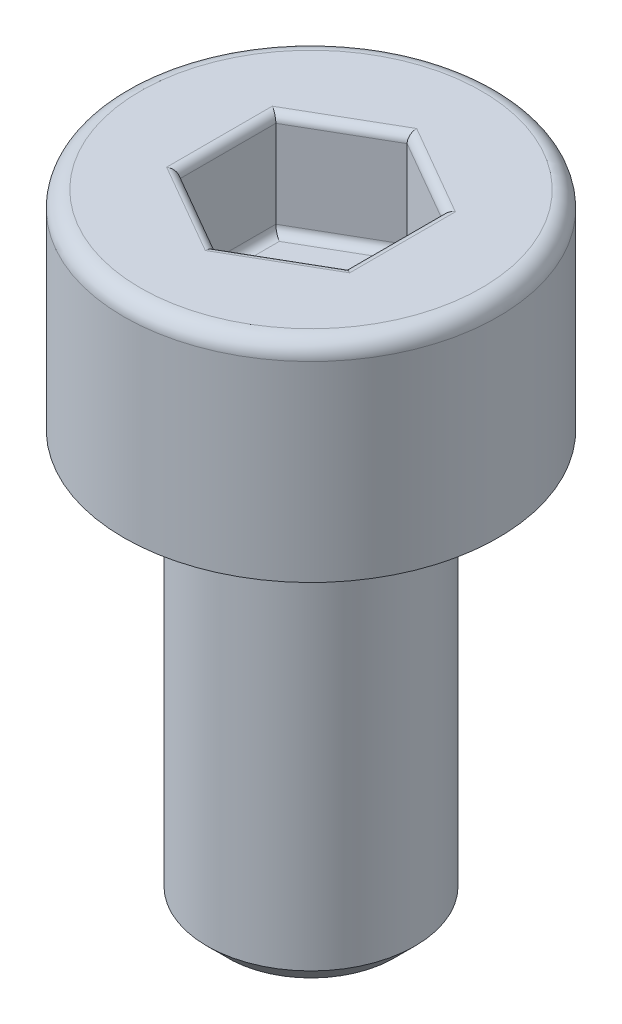
ISO-10303-21;
HEADER;
FILE_DESCRIPTION(('STEP AP214'),'2;1');
FILE_NAME('part.step','',(''),(''),'','','');
FILE_SCHEMA(('AUTOMOTIVE_DESIGN { 1 0 10303 214 1 1 1 1 }'));
ENDSEC;
DATA;
#1=APPLICATION_CONTEXT('core data for automotive mechanical design processes');
#2=APPLICATION_PROTOCOL_DEFINITION('international standard','automotive_design',2000,#1);
#3=PRODUCT_CONTEXT('',#1,'mechanical');
#4=PRODUCT('Part','Part','',(#3));
#5=PRODUCT_RELATED_PRODUCT_CATEGORY('part','',(#4));
#6=PRODUCT_DEFINITION_FORMATION('','',#4);
#7=PRODUCT_DEFINITION_CONTEXT('part definition',#1,'design');
#8=PRODUCT_DEFINITION('design','',#6,#7);
#9=PRODUCT_DEFINITION_SHAPE('','',#8);
#10=(LENGTH_UNIT() NAMED_UNIT(*) SI_UNIT(.MILLI.,.METRE.));
#11=(NAMED_UNIT(*) PLANE_ANGLE_UNIT() SI_UNIT($,.RADIAN.));
#12=(NAMED_UNIT(*) SI_UNIT($,.STERADIAN.) SOLID_ANGLE_UNIT());
#13=UNCERTAINTY_MEASURE_WITH_UNIT(LENGTH_MEASURE(1.E-05),#10,'distance_accuracy_value','');
#14=(GEOMETRIC_REPRESENTATION_CONTEXT(3) GLOBAL_UNCERTAINTY_ASSIGNED_CONTEXT((#13)) GLOBAL_UNIT_ASSIGNED_CONTEXT((#10,
#11,#12)) REPRESENTATION_CONTEXT('',''));
#15=CARTESIAN_POINT('',(0.,0.,0.));
#16=DIRECTION('',(0.,0.,1.));
#17=DIRECTION('',(1.,0.,0.));
#18=AXIS2_PLACEMENT_3D('',#15,#16,#17);
#19=CARTESIAN_POINT('',(0.,-7.5,0.));
#20=DIRECTION('',(0.,-1.,0.));
#21=DIRECTION('',(0.,0.,-1.));
#22=AXIS2_PLACEMENT_3D('',#19,#20,#21);
#23=PLANE('',#22);
#24=CARTESIAN_POINT('',(0.,-7.5,0.));
#25=DIRECTION('',(0.,-1.,0.));
#26=DIRECTION('',(0.,0.,-1.));
#27=AXIS2_PLACEMENT_3D('',#24,#25,#26);
#28=CIRCLE('',#27,0.999999999999997);
#29=CARTESIAN_POINT('',(0.,-7.5,-0.999999999999997));
#30=VERTEX_POINT('',#29);
#31=EDGE_CURVE('E261',#30,#30,#28,.T.);
#32=ORIENTED_EDGE('',*,*,#31,.T.);
#33=EDGE_LOOP('',(#32));
#34=FACE_BOUND('',#33,.T.);
#35=ADVANCED_FACE('F33',(#34),#23,.T.);
#36=CARTESIAN_POINT('',(0.,0.,0.));
#37=DIRECTION('',(0.,1.,0.));
#38=DIRECTION('',(0.,0.,1.));
#39=AXIS2_PLACEMENT_3D('',#36,#37,#38);
#40=CYLINDRICAL_SURFACE('',#39,1.25);
#41=CARTESIAN_POINT('',(0.,-2.75,0.));
#42=DIRECTION('',(0.,-1.,0.));
#43=DIRECTION('',(0.,0.,-1.));
#44=AXIS2_PLACEMENT_3D('',#41,#42,#43);
#45=CIRCLE('',#44,1.25);
#46=CARTESIAN_POINT('',(0.,-2.75,-1.25));
#47=VERTEX_POINT('',#46);
#48=EDGE_CURVE('E258',#47,#47,#45,.T.);
#49=ORIENTED_EDGE('',*,*,#48,.T.);
#50=EDGE_LOOP('',(#49));
#51=FACE_BOUND('',#50,.T.);
#52=CARTESIAN_POINT('',(0.,-7.25,0.));
#53=DIRECTION('',(0.,-1.,0.));
#54=DIRECTION('',(0.,0.,-1.));
#55=AXIS2_PLACEMENT_3D('',#52,#53,#54);
#56=CIRCLE('',#55,1.25);
#57=CARTESIAN_POINT('',(0.,-7.25,-1.25));
#58=VERTEX_POINT('',#57);
#59=EDGE_CURVE('E255',#58,#58,#56,.F.);
#60=ORIENTED_EDGE('',*,*,#59,.T.);
#61=EDGE_LOOP('',(#60));
#62=FACE_BOUND('',#61,.T.);
#63=ADVANCED_FACE('F287',(#51,#62),#40,.T.);
#64=CARTESIAN_POINT('',(-1.25,-2.5,0.));
#65=DIRECTION('',(0.,-1.,0.));
#66=DIRECTION('',(0.,0.,-1.));
#67=AXIS2_PLACEMENT_3D('',#64,#65,#66);
#68=PLANE('',#67);
#69=CARTESIAN_POINT('',(0.,-2.5,0.));
#70=DIRECTION('',(0.,-1.,0.));
#71=DIRECTION('',(0.,0.,-1.));
#72=AXIS2_PLACEMENT_3D('',#69,#70,#71);
#73=CIRCLE('',#72,1.5);
#74=CARTESIAN_POINT('',(0.,-2.5,-1.5));
#75=VERTEX_POINT('',#74);
#76=EDGE_CURVE('E252',#75,#75,#73,.F.);
#77=ORIENTED_EDGE('',*,*,#76,.T.);
#78=EDGE_LOOP('',(#77));
#79=FACE_BOUND('',#78,.T.);
#80=CARTESIAN_POINT('',(0.,-2.5,0.));
#81=DIRECTION('',(0.,1.,0.));
#82=DIRECTION('',(0.,0.,1.));
#83=AXIS2_PLACEMENT_3D('',#80,#81,#82);
#84=CIRCLE('',#83,2.25);
#85=CARTESIAN_POINT('',(0.,-2.5,2.25));
#86=VERTEX_POINT('',#85);
#87=EDGE_CURVE('E249',#86,#86,#84,.T.);
#88=ORIENTED_EDGE('',*,*,#87,.F.);
#89=EDGE_LOOP('',(#88));
#90=FACE_BOUND('',#89,.T.);
#91=ADVANCED_FACE('F293',(#79,#90),#68,.T.);
#92=CARTESIAN_POINT('',(0.,0.,0.));
#93=DIRECTION('',(0.,1.,0.));
#94=DIRECTION('',(0.,0.,1.));
#95=AXIS2_PLACEMENT_3D('',#92,#93,#94);
#96=CYLINDRICAL_SURFACE('',#95,2.25);
#97=CARTESIAN_POINT('',(0.,-0.2,0.));
#98=DIRECTION('',(0.,1.,0.));
#99=DIRECTION('',(0.,0.,1.));
#100=AXIS2_PLACEMENT_3D('',#97,#98,#99);
#101=CIRCLE('',#100,2.25);
#102=CARTESIAN_POINT('',(0.,-0.2,2.25));
#103=VERTEX_POINT('',#102);
#104=EDGE_CURVE('E159',#103,#103,#101,.F.);
#105=ORIENTED_EDGE('',*,*,#104,.T.);
#106=EDGE_LOOP('',(#105));
#107=FACE_BOUND('',#106,.T.);
#108=ORIENTED_EDGE('',*,*,#87,.T.);
#109=EDGE_LOOP('',(#108));
#110=FACE_BOUND('',#109,.T.);
#111=ADVANCED_FACE('F303',(#107,#110),#96,.T.);
#112=CARTESIAN_POINT('',(-2.25,0.,0.));
#113=DIRECTION('',(0.,1.,0.));
#114=DIRECTION('',(0.,0.,1.));
#115=AXIS2_PLACEMENT_3D('',#112,#113,#114);
#116=PLANE('',#115);
#117=DIRECTION('',(0.,0.,1.));
#118=VECTOR('',#117,1.);
#119=CARTESIAN_POINT('',(-1.1,0.,-0.577350269189627));
#120=LINE('',#119,#118);
#121=CARTESIAN_POINT('',(-1.1,0.,0.635085296108588));
#122=VERTEX_POINT('',#121);
#123=CARTESIAN_POINT('',(-1.1,0.,-0.635085296108589));
#124=VERTEX_POINT('',#123);
#125=EDGE_CURVE('E175',#122,#124,#120,.F.);
#126=ORIENTED_EDGE('',*,*,#125,.T.);
#127=DIRECTION('',(-0.866025403784439,0.,0.5));
#128=VECTOR('',#127,1.);
#129=CARTESIAN_POINT('',(-0.0500000000000009,0.,-1.2413030787577));
#130=LINE('',#129,#128);
#131=CARTESIAN_POINT('',(0.,0.,-1.27017059221718));
#132=VERTEX_POINT('',#131);
#133=EDGE_CURVE('E134',#124,#132,#130,.F.);
#134=ORIENTED_EDGE('',*,*,#133,.T.);
#135=DIRECTION('',(-0.866025403784439,0.,-0.5));
#136=VECTOR('',#135,1.);
#137=CARTESIAN_POINT('',(1.05,0.,-0.663952809568071));
#138=LINE('',#137,#136);
#139=CARTESIAN_POINT('',(1.1,0.,-0.63508529610859));
#140=VERTEX_POINT('',#139);
#141=EDGE_CURVE('E161',#132,#140,#138,.F.);
#142=ORIENTED_EDGE('',*,*,#141,.T.);
#143=DIRECTION('',(0.,0.,-1.));
#144=VECTOR('',#143,1.);
#145=CARTESIAN_POINT('',(1.1,0.,0.577350269189625));
#146=LINE('',#145,#144);
#147=CARTESIAN_POINT('',(1.1,0.,0.635085296108588));
#148=VERTEX_POINT('',#147);
#149=EDGE_CURVE('E169',#140,#148,#146,.F.);
#150=ORIENTED_EDGE('',*,*,#149,.T.);
#151=DIRECTION('',(0.866025403784439,0.,-0.5));
#152=VECTOR('',#151,1.);
#153=CARTESIAN_POINT('',(0.0499999999999991,0.,1.24130307875769));
#154=LINE('',#153,#152);
#155=CARTESIAN_POINT('',(0.,0.,1.27017059221718));
#156=VERTEX_POINT('',#155);
#157=EDGE_CURVE('E171',#148,#156,#154,.F.);
#158=ORIENTED_EDGE('',*,*,#157,.T.);
#159=DIRECTION('',(0.866025403784439,0.,0.5));
#160=VECTOR('',#159,1.);
#161=CARTESIAN_POINT('',(-1.05,0.,0.663952809568069));
#162=LINE('',#161,#160);
#163=EDGE_CURVE('E173',#156,#122,#162,.F.);
#164=ORIENTED_EDGE('',*,*,#163,.T.);
#165=EDGE_LOOP('',(#126,#134,#142,#150,#158,#164));
#166=FACE_BOUND('',#165,.T.);
#167=CARTESIAN_POINT('',(0.,0.,0.));
#168=DIRECTION('',(0.,1.,0.));
#169=DIRECTION('',(0.,0.,1.));
#170=AXIS2_PLACEMENT_3D('',#167,#168,#169);
#171=CIRCLE('',#170,2.05);
#172=CARTESIAN_POINT('',(0.,0.,2.05));
#173=VERTEX_POINT('',#172);
#174=EDGE_CURVE('E164',#173,#173,#171,.T.);
#175=ORIENTED_EDGE('',*,*,#174,.T.);
#176=EDGE_LOOP('',(#175));
#177=FACE_BOUND('',#176,.T.);
#178=ADVANCED_FACE('F266',(#166,#177),#116,.T.);
#179=CARTESIAN_POINT('',(0.,-2.5,0.));
#180=DIRECTION('',(0.,1.,0.));
#181=DIRECTION('',(0.,0.,1.));
#182=AXIS2_PLACEMENT_3D('',#179,#180,#181);
#183=CONICAL_SURFACE('',#182,1.5,0.785398163397454);
#184=ORIENTED_EDGE('',*,*,#48,.F.);
#185=EDGE_LOOP('',(#184));
#186=FACE_BOUND('',#185,.T.);
#187=ORIENTED_EDGE('',*,*,#76,.F.);
#188=EDGE_LOOP('',(#187));
#189=FACE_BOUND('',#188,.T.);
#190=ADVANCED_FACE('F281',(#186,#189),#183,.T.);
#191=CARTESIAN_POINT('',(0.,-7.25,0.));
#192=DIRECTION('',(0.,1.,0.));
#193=DIRECTION('',(0.,0.,1.));
#194=AXIS2_PLACEMENT_3D('',#191,#192,#193);
#195=CONICAL_SURFACE('',#194,1.25,0.78539816339745);
#196=ORIENTED_EDGE('',*,*,#31,.F.);
#197=EDGE_LOOP('',(#196));
#198=FACE_BOUND('',#197,.T.);
#199=ORIENTED_EDGE('',*,*,#59,.F.);
#200=EDGE_LOOP('',(#199));
#201=FACE_BOUND('',#200,.T.);
#202=ADVANCED_FACE('F271',(#198,#201),#195,.T.);
#203=CARTESIAN_POINT('',(0.,-0.2,0.));
#204=DIRECTION('',(0.,1.,0.));
#205=DIRECTION('',(0.,0.,1.));
#206=AXIS2_PLACEMENT_3D('',#203,#204,#205);
#207=TOROIDAL_SURFACE('',#206,2.05,0.2);
#208=ORIENTED_EDGE('',*,*,#104,.F.);
#209=EDGE_LOOP('',(#208));
#210=FACE_BOUND('',#209,.T.);
#211=ORIENTED_EDGE('',*,*,#174,.F.);
#212=EDGE_LOOP('',(#211));
#213=FACE_BOUND('',#212,.T.);
#214=ADVANCED_FACE('F268',(#210,#213),#207,.T.);
#215=CARTESIAN_POINT('',(0.999999999999998,-1.25,-0.577350269189627));
#216=DIRECTION('',(0.5,0.,-0.866025403784439));
#217=DIRECTION('',(-0.866025403784439,0.,-0.5));
#218=AXIS2_PLACEMENT_3D('',#215,#216,#217);
#219=PLANE('',#218);
#220=DIRECTION('',(0.,1.,0.));
#221=VECTOR('',#220,1.);
#222=CARTESIAN_POINT('',(0.999999999999998,-1.25,-0.577350269189627));
#223=LINE('',#222,#221);
#224=CARTESIAN_POINT('',(0.999999999999998,-1.15,-0.577350269189627));
#225=VERTEX_POINT('',#224);
#226=CARTESIAN_POINT('',(0.999999999999998,-0.1,-0.577350269189627));
#227=VERTEX_POINT('',#226);
#228=EDGE_CURVE('E243',#225,#227,#223,.T.);
#229=ORIENTED_EDGE('',*,*,#228,.T.);
#230=DIRECTION('',(-0.866025403784439,0.,-0.5));
#231=VECTOR('',#230,1.);
#232=CARTESIAN_POINT('',(0.,-0.1,-1.15470053837925));
#233=LINE('',#232,#231);
#234=CARTESIAN_POINT('',(0.,-0.1,-1.15470053837925));
#235=VERTEX_POINT('',#234);
#236=EDGE_CURVE('E195',#227,#235,#233,.T.);
#237=ORIENTED_EDGE('',*,*,#236,.T.);
#238=DIRECTION('',(0.,1.,0.));
#239=VECTOR('',#238,1.);
#240=CARTESIAN_POINT('',(0.,-1.25,-1.15470053837925));
#241=LINE('',#240,#239);
#242=CARTESIAN_POINT('',(0.,-1.15,-1.15470053837925));
#243=VERTEX_POINT('',#242);
#244=EDGE_CURVE('E145',#243,#235,#241,.T.);
#245=ORIENTED_EDGE('',*,*,#244,.F.);
#246=DIRECTION('',(-0.866025403784439,0.,-0.5));
#247=VECTOR('',#246,1.);
#248=CARTESIAN_POINT('',(0.999999999999998,-1.15,-0.577350269189627));
#249=LINE('',#248,#247);
#250=EDGE_CURVE('E193',#243,#225,#249,.F.);
#251=ORIENTED_EDGE('',*,*,#250,.T.);
#252=EDGE_LOOP('',(#229,#237,#245,#251));
#253=FACE_BOUND('',#252,.T.);
#254=ADVANCED_FACE('F270',(#253),#219,.F.);
#255=CARTESIAN_POINT('',(0.999999999999999,-1.25,0.577350269189625));
#256=DIRECTION('',(1.,0.,0.));
#257=DIRECTION('',(0.,0.,-1.));
#258=AXIS2_PLACEMENT_3D('',#255,#256,#257);
#259=PLANE('',#258);
#260=DIRECTION('',(0.,1.,0.));
#261=VECTOR('',#260,1.);
#262=CARTESIAN_POINT('',(0.999999999999999,-1.25,0.577350269189625));
#263=LINE('',#262,#261);
#264=CARTESIAN_POINT('',(0.999999999999999,-1.15,0.577350269189625));
#265=VERTEX_POINT('',#264);
#266=CARTESIAN_POINT('',(0.999999999999999,-0.1,0.577350269189625));
#267=VERTEX_POINT('',#266);
#268=EDGE_CURVE('E240',#265,#267,#263,.T.);
#269=ORIENTED_EDGE('',*,*,#268,.T.);
#270=DIRECTION('',(0.,0.,-1.));
#271=VECTOR('',#270,1.);
#272=CARTESIAN_POINT('',(0.999999999999998,-0.1,-0.577350269189627));
#273=LINE('',#272,#271);
#274=EDGE_CURVE('E191',#267,#227,#273,.T.);
#275=ORIENTED_EDGE('',*,*,#274,.T.);
#276=ORIENTED_EDGE('',*,*,#228,.F.);
#277=DIRECTION('',(0.,0.,-1.));
#278=VECTOR('',#277,1.);
#279=CARTESIAN_POINT('',(0.999999999999999,-1.15,0.577350269189625));
#280=LINE('',#279,#278);
#281=EDGE_CURVE('E188',#225,#265,#280,.F.);
#282=ORIENTED_EDGE('',*,*,#281,.T.);
#283=EDGE_LOOP('',(#269,#275,#276,#282));
#284=FACE_BOUND('',#283,.T.);
#285=ADVANCED_FACE('F278',(#284),#259,.F.);
#286=CARTESIAN_POINT('',(0.,-1.25,1.15470053837925));
#287=DIRECTION('',(0.5,0.,0.866025403784439));
#288=DIRECTION('',(0.866025403784439,0.,-0.5));
#289=AXIS2_PLACEMENT_3D('',#286,#287,#288);
#290=PLANE('',#289);
#291=DIRECTION('',(0.,1.,0.));
#292=VECTOR('',#291,1.);
#293=CARTESIAN_POINT('',(0.,-1.25,1.15470053837925));
#294=LINE('',#293,#292);
#295=CARTESIAN_POINT('',(0.,-1.15,1.15470053837925));
#296=VERTEX_POINT('',#295);
#297=CARTESIAN_POINT('',(0.,-0.1,1.15470053837925));
#298=VERTEX_POINT('',#297);
#299=EDGE_CURVE('E237',#296,#298,#294,.T.);
#300=ORIENTED_EDGE('',*,*,#299,.T.);
#301=DIRECTION('',(0.866025403784439,0.,-0.5));
#302=VECTOR('',#301,1.);
#303=CARTESIAN_POINT('',(0.999999999999999,-0.1,0.577350269189625));
#304=LINE('',#303,#302);
#305=EDGE_CURVE('E186',#298,#267,#304,.T.);
#306=ORIENTED_EDGE('',*,*,#305,.T.);
#307=ORIENTED_EDGE('',*,*,#268,.F.);
#308=DIRECTION('',(0.866025403784439,0.,-0.5));
#309=VECTOR('',#308,1.);
#310=CARTESIAN_POINT('',(0.,-1.15,1.15470053837925));
#311=LINE('',#310,#309);
#312=EDGE_CURVE('E184',#265,#296,#311,.F.);
#313=ORIENTED_EDGE('',*,*,#312,.T.);
#314=EDGE_LOOP('',(#300,#306,#307,#313));
#315=FACE_BOUND('',#314,.T.);
#316=ADVANCED_FACE('F327',(#315),#290,.F.);
#317=CARTESIAN_POINT('',(-1.,-1.25,0.577350269189625));
#318=DIRECTION('',(-0.5,0.,0.866025403784438));
#319=DIRECTION('',(0.866025403784439,0.,0.5));
#320=AXIS2_PLACEMENT_3D('',#317,#318,#319);
#321=PLANE('',#320);
#322=DIRECTION('',(0.,1.,0.));
#323=VECTOR('',#322,1.);
#324=CARTESIAN_POINT('',(-1.,-1.25,0.577350269189625));
#325=LINE('',#324,#323);
#326=CARTESIAN_POINT('',(-1.,-1.15,0.577350269189625));
#327=VERTEX_POINT('',#326);
#328=CARTESIAN_POINT('',(-1.,-0.1,0.577350269189625));
#329=VERTEX_POINT('',#328);
#330=EDGE_CURVE('E128',#327,#329,#325,.T.);
#331=ORIENTED_EDGE('',*,*,#330,.T.);
#332=DIRECTION('',(0.866025403784439,0.,0.5));
#333=VECTOR('',#332,1.);
#334=CARTESIAN_POINT('',(0.,-0.1,1.15470053837925));
#335=LINE('',#334,#333);
#336=EDGE_CURVE('E182',#329,#298,#335,.T.);
#337=ORIENTED_EDGE('',*,*,#336,.T.);
#338=ORIENTED_EDGE('',*,*,#299,.F.);
#339=DIRECTION('',(0.866025403784439,0.,0.5));
#340=VECTOR('',#339,1.);
#341=CARTESIAN_POINT('',(-1.,-1.15,0.577350269189625));
#342=LINE('',#341,#340);
#343=EDGE_CURVE('E180',#296,#327,#342,.F.);
#344=ORIENTED_EDGE('',*,*,#343,.T.);
#345=EDGE_LOOP('',(#331,#337,#338,#344));
#346=FACE_BOUND('',#345,.T.);
#347=ADVANCED_FACE('F234',(#346),#321,.F.);
#348=CARTESIAN_POINT('',(-1.,-1.25,-0.577350269189627));
#349=DIRECTION('',(-1.,0.,0.));
#350=DIRECTION('',(0.,0.,1.));
#351=AXIS2_PLACEMENT_3D('',#348,#349,#350);
#352=PLANE('',#351);
#353=DIRECTION('',(0.,1.,0.));
#354=VECTOR('',#353,1.);
#355=CARTESIAN_POINT('',(-1.,-1.25,-0.577350269189627));
#356=LINE('',#355,#354);
#357=CARTESIAN_POINT('',(-1.,-1.15,-0.577350269189627));
#358=VERTEX_POINT('',#357);
#359=CARTESIAN_POINT('',(-1.,-0.1,-0.577350269189627));
#360=VERTEX_POINT('',#359);
#361=EDGE_CURVE('E126',#358,#360,#356,.T.);
#362=ORIENTED_EDGE('',*,*,#361,.T.);
#363=DIRECTION('',(0.,0.,1.));
#364=VECTOR('',#363,1.);
#365=CARTESIAN_POINT('',(-1.,-0.1,0.577350269189625));
#366=LINE('',#365,#364);
#367=EDGE_CURVE('E133',#360,#329,#366,.T.);
#368=ORIENTED_EDGE('',*,*,#367,.T.);
#369=ORIENTED_EDGE('',*,*,#330,.F.);
#370=DIRECTION('',(0.,0.,1.));
#371=VECTOR('',#370,1.);
#372=CARTESIAN_POINT('',(-1.,-1.15,-0.577350269189627));
#373=LINE('',#372,#371);
#374=EDGE_CURVE('E123',#327,#358,#373,.F.);
#375=ORIENTED_EDGE('',*,*,#374,.T.);
#376=EDGE_LOOP('',(#362,#368,#369,#375));
#377=FACE_BOUND('',#376,.T.);
#378=ADVANCED_FACE('F125',(#377),#352,.F.);
#379=CARTESIAN_POINT('',(0.,-1.25,-1.15470053837925));
#380=DIRECTION('',(-0.5,0.,-0.866025403784438));
#381=DIRECTION('',(-0.866025403784439,0.,0.5));
#382=AXIS2_PLACEMENT_3D('',#379,#380,#381);
#383=PLANE('',#382);
#384=ORIENTED_EDGE('',*,*,#244,.T.);
#385=DIRECTION('',(-0.866025403784439,0.,0.5));
#386=VECTOR('',#385,1.);
#387=CARTESIAN_POINT('',(-1.,-0.1,-0.577350269189626));
#388=LINE('',#387,#386);
#389=EDGE_CURVE('E144',#235,#360,#388,.T.);
#390=ORIENTED_EDGE('',*,*,#389,.T.);
#391=ORIENTED_EDGE('',*,*,#361,.F.);
#392=DIRECTION('',(-0.866025403784439,0.,0.5));
#393=VECTOR('',#392,1.);
#394=CARTESIAN_POINT('',(0.,-1.15,-1.15470053837925));
#395=LINE('',#394,#393);
#396=EDGE_CURVE('E141',#358,#243,#395,.F.);
#397=ORIENTED_EDGE('',*,*,#396,.T.);
#398=EDGE_LOOP('',(#384,#390,#391,#397));
#399=FACE_BOUND('',#398,.T.);
#400=ADVANCED_FACE('F139',(#399),#383,.F.);
#401=CARTESIAN_POINT('',(0.,-1.25,-1.15470053837925));
#402=DIRECTION('',(0.,1.,0.));
#403=DIRECTION('',(0.,0.,1.));
#404=AXIS2_PLACEMENT_3D('',#401,#402,#403);
#405=PLANE('',#404);
#406=DIRECTION('',(0.866025403784439,0.,-0.5));
#407=VECTOR('',#406,1.);
#408=CARTESIAN_POINT('',(0.949999999999999,-1.25,0.490747728811181));
#409=LINE('',#408,#407);
#410=CARTESIAN_POINT('',(0.,-1.25,1.03923048454133));
#411=VERTEX_POINT('',#410);
#412=CARTESIAN_POINT('',(0.899999999999999,-1.25,0.519615242270663));
#413=VERTEX_POINT('',#412);
#414=EDGE_CURVE('E42',#411,#413,#409,.T.);
#415=ORIENTED_EDGE('',*,*,#414,.T.);
#416=DIRECTION('',(0.,0.,-1.));
#417=VECTOR('',#416,1.);
#418=CARTESIAN_POINT('',(0.899999999999998,-1.25,-1.15470053837925));
#419=LINE('',#418,#417);
#420=CARTESIAN_POINT('',(0.899999999999998,-1.25,-0.519615242270664));
#421=VERTEX_POINT('',#420);
#422=EDGE_CURVE('E11',#413,#421,#419,.T.);
#423=ORIENTED_EDGE('',*,*,#422,.T.);
#424=DIRECTION('',(-0.866025403784439,0.,-0.5));
#425=VECTOR('',#424,1.);
#426=CARTESIAN_POINT('',(-0.0500000000000008,-1.25,-1.06809799800081));
#427=LINE('',#426,#425);
#428=CARTESIAN_POINT('',(0.,-1.25,-1.03923048454133));
#429=VERTEX_POINT('',#428);
#430=EDGE_CURVE('E197',#421,#429,#427,.T.);
#431=ORIENTED_EDGE('',*,*,#430,.T.);
#432=DIRECTION('',(-0.866025403784439,0.,0.5));
#433=VECTOR('',#432,1.);
#434=CARTESIAN_POINT('',(0.0499999999999993,-1.25,-1.06809799800081));
#435=LINE('',#434,#433);
#436=CARTESIAN_POINT('',(-0.9,-1.25,-0.519615242270664));
#437=VERTEX_POINT('',#436);
#438=EDGE_CURVE('E199',#429,#437,#435,.T.);
#439=ORIENTED_EDGE('',*,*,#438,.T.);
#440=DIRECTION('',(0.,0.,1.));
#441=VECTOR('',#440,1.);
#442=CARTESIAN_POINT('',(-0.9,-1.25,-1.15470053837925));
#443=LINE('',#442,#441);
#444=CARTESIAN_POINT('',(-0.9,-1.25,0.519615242270662));
#445=VERTEX_POINT('',#444);
#446=EDGE_CURVE('E150',#437,#445,#443,.T.);
#447=ORIENTED_EDGE('',*,*,#446,.T.);
#448=DIRECTION('',(0.866025403784439,0.,0.5));
#449=VECTOR('',#448,1.);
#450=CARTESIAN_POINT('',(-0.950000000000001,-1.25,0.490747728811181));
#451=LINE('',#450,#449);
#452=EDGE_CURVE('E53',#445,#411,#451,.T.);
#453=ORIENTED_EDGE('',*,*,#452,.T.);
#454=EDGE_LOOP('',(#415,#423,#431,#439,#447,#453));
#455=FACE_BOUND('',#454,.T.);
#456=ADVANCED_FACE('F322',(#455),#405,.T.);
#457=CARTESIAN_POINT('',(0.0499999999999991,-0.1,1.24130307875769));
#458=DIRECTION('',(-0.866025403784439,0.,0.5));
#459=DIRECTION('',(0.5,0.,0.866025403784439));
#460=AXIS2_PLACEMENT_3D('',#457,#458,#459);
#461=CYLINDRICAL_SURFACE('',#460,0.1);
#462=CARTESIAN_POINT('',(0.,-0.1,1.27017059221718));
#463=DIRECTION('',(-1.,0.,0.));
#464=DIRECTION('',(0.,0.,-1.));
#465=AXIS2_PLACEMENT_3D('',#462,#463,#464);
#466=ELLIPSE('',#465,0.115470053837925,0.1);
#467=EDGE_CURVE('E214',#156,#298,#466,.T.);
#468=ORIENTED_EDGE('',*,*,#467,.F.);
#469=ORIENTED_EDGE('',*,*,#157,.F.);
#470=CARTESIAN_POINT('',(1.1,-0.1,0.635085296108588));
#471=DIRECTION('',(-0.5,0.,0.866025403784439));
#472=DIRECTION('',(-0.866025403784439,0.,-0.5));
#473=AXIS2_PLACEMENT_3D('',#470,#471,#472);
#474=ELLIPSE('',#473,0.115470053837925,0.1);
#475=EDGE_CURVE('E217',#267,#148,#474,.F.);
#476=ORIENTED_EDGE('',*,*,#475,.F.);
#477=ORIENTED_EDGE('',*,*,#305,.F.);
#478=EDGE_LOOP('',(#468,#469,#476,#477));
#479=FACE_BOUND('',#478,.T.);
#480=ADVANCED_FACE('F334',(#479),#461,.T.);
#481=CARTESIAN_POINT('',(1.1,-0.1,0.577350269189625));
#482=DIRECTION('',(0.,0.,1.));
#483=DIRECTION('',(1.,0.,0.));
#484=AXIS2_PLACEMENT_3D('',#481,#482,#483);
#485=CYLINDRICAL_SURFACE('',#484,0.1);
#486=ORIENTED_EDGE('',*,*,#475,.T.);
#487=ORIENTED_EDGE('',*,*,#149,.F.);
#488=CARTESIAN_POINT('',(1.1,-0.1,-0.63508529610859));
#489=DIRECTION('',(0.5,0.,0.866025403784439));
#490=DIRECTION('',(-0.866025403784439,0.,0.5));
#491=AXIS2_PLACEMENT_3D('',#488,#489,#490);
#492=ELLIPSE('',#491,0.115470053837925,0.1);
#493=EDGE_CURVE('E211',#227,#140,#492,.F.);
#494=ORIENTED_EDGE('',*,*,#493,.F.);
#495=ORIENTED_EDGE('',*,*,#274,.F.);
#496=EDGE_LOOP('',(#486,#487,#494,#495));
#497=FACE_BOUND('',#496,.T.);
#498=ADVANCED_FACE('F338',(#497),#485,.T.);
#499=CARTESIAN_POINT('',(-1.05,-0.1,0.663952809568069));
#500=DIRECTION('',(-0.866025403784439,0.,-0.5));
#501=DIRECTION('',(-0.5,0.,0.866025403784438));
#502=AXIS2_PLACEMENT_3D('',#499,#500,#501);
#503=CYLINDRICAL_SURFACE('',#502,0.1);
#504=ORIENTED_EDGE('',*,*,#467,.T.);
#505=ORIENTED_EDGE('',*,*,#336,.F.);
#506=CARTESIAN_POINT('',(-1.1,-0.1,0.635085296108587));
#507=DIRECTION('',(-0.5,0.,-0.866025403784439));
#508=DIRECTION('',(0.866025403784439,0.,-0.5));
#509=AXIS2_PLACEMENT_3D('',#506,#507,#508);
#510=ELLIPSE('',#509,0.115470053837925,0.1);
#511=EDGE_CURVE('E208',#122,#329,#510,.T.);
#512=ORIENTED_EDGE('',*,*,#511,.F.);
#513=ORIENTED_EDGE('',*,*,#163,.F.);
#514=EDGE_LOOP('',(#504,#505,#512,#513));
#515=FACE_BOUND('',#514,.T.);
#516=ADVANCED_FACE('F344',(#515),#503,.T.);
#517=CARTESIAN_POINT('',(1.05,-0.1,-0.663952809568071));
#518=DIRECTION('',(0.866025403784439,0.,0.5));
#519=DIRECTION('',(0.5,0.,-0.866025403784439));
#520=AXIS2_PLACEMENT_3D('',#517,#518,#519);
#521=CYLINDRICAL_SURFACE('',#520,0.1);
#522=ORIENTED_EDGE('',*,*,#493,.T.);
#523=ORIENTED_EDGE('',*,*,#141,.F.);
#524=CARTESIAN_POINT('',(0.,-0.1,-1.27017059221718));
#525=DIRECTION('',(1.,0.,0.));
#526=DIRECTION('',(0.,0.,-1.));
#527=AXIS2_PLACEMENT_3D('',#524,#525,#526);
#528=ELLIPSE('',#527,0.115470053837925,0.1);
#529=EDGE_CURVE('E206',#235,#132,#528,.F.);
#530=ORIENTED_EDGE('',*,*,#529,.F.);
#531=ORIENTED_EDGE('',*,*,#236,.F.);
#532=EDGE_LOOP('',(#522,#523,#530,#531));
#533=FACE_BOUND('',#532,.T.);
#534=ADVANCED_FACE('F374',(#533),#521,.T.);
#535=CARTESIAN_POINT('',(-1.1,-0.1,-0.577350269189627));
#536=DIRECTION('',(0.,0.,-1.));
#537=DIRECTION('',(-1.,0.,0.));
#538=AXIS2_PLACEMENT_3D('',#535,#536,#537);
#539=CYLINDRICAL_SURFACE('',#538,0.1);
#540=ORIENTED_EDGE('',*,*,#511,.T.);
#541=ORIENTED_EDGE('',*,*,#367,.F.);
#542=CARTESIAN_POINT('',(-1.1,-0.1,-0.635085296108589));
#543=DIRECTION('',(0.5,0.,-0.866025403784439));
#544=DIRECTION('',(0.866025403784439,0.,0.5));
#545=AXIS2_PLACEMENT_3D('',#542,#543,#544);
#546=ELLIPSE('',#545,0.115470053837925,0.1);
#547=EDGE_CURVE('E204',#124,#360,#546,.T.);
#548=ORIENTED_EDGE('',*,*,#547,.F.);
#549=ORIENTED_EDGE('',*,*,#125,.F.);
#550=EDGE_LOOP('',(#540,#541,#548,#549));
#551=FACE_BOUND('',#550,.T.);
#552=ADVANCED_FACE('F369',(#551),#539,.T.);
#553=CARTESIAN_POINT('',(-0.0500000000000009,-0.1,-1.2413030787577));
#554=DIRECTION('',(0.866025403784439,0.,-0.5));
#555=DIRECTION('',(-0.5,0.,-0.866025403784438));
#556=AXIS2_PLACEMENT_3D('',#553,#554,#555);
#557=CYLINDRICAL_SURFACE('',#556,0.1);
#558=ORIENTED_EDGE('',*,*,#529,.T.);
#559=ORIENTED_EDGE('',*,*,#133,.F.);
#560=ORIENTED_EDGE('',*,*,#547,.T.);
#561=ORIENTED_EDGE('',*,*,#389,.F.);
#562=EDGE_LOOP('',(#558,#559,#560,#561));
#563=FACE_BOUND('',#562,.T.);
#564=ADVANCED_FACE('F365',(#563),#557,.T.);
#565=CARTESIAN_POINT('',(-0.9,-1.15,-1.15470053837925));
#566=DIRECTION('',(0.,0.,1.));
#567=DIRECTION('',(1.,0.,0.));
#568=AXIS2_PLACEMENT_3D('',#565,#566,#567);
#569=CYLINDRICAL_SURFACE('',#568,0.1);
#570=CARTESIAN_POINT('',(-0.900000000000001,-1.15,-0.519615242270664));
#571=DIRECTION('',(-0.5,0.,0.866025403784439));
#572=DIRECTION('',(0.866025403784439,0.,0.5));
#573=AXIS2_PLACEMENT_3D('',#570,#571,#572);
#574=ELLIPSE('',#573,0.115470053837925,0.1);
#575=EDGE_CURVE('E149',#358,#437,#574,.T.);
#576=ORIENTED_EDGE('',*,*,#575,.F.);
#577=ORIENTED_EDGE('',*,*,#374,.F.);
#578=CARTESIAN_POINT('',(-0.9,-1.15,0.519615242270662));
#579=DIRECTION('',(0.5,0.,0.866025403784439));
#580=DIRECTION('',(0.866025403784439,0.,-0.5));
#581=AXIS2_PLACEMENT_3D('',#578,#579,#580);
#582=ELLIPSE('',#581,0.115470053837925,0.1);
#583=EDGE_CURVE('E37',#445,#327,#582,.F.);
#584=ORIENTED_EDGE('',*,*,#583,.F.);
#585=ORIENTED_EDGE('',*,*,#446,.F.);
#586=EDGE_LOOP('',(#576,#577,#584,#585));
#587=FACE_BOUND('',#586,.T.);
#588=ADVANCED_FACE('F35',(#587),#569,.F.);
#589=CARTESIAN_POINT('',(-0.950000000000001,-1.15,0.490747728811181));
#590=DIRECTION('',(0.866025403784439,0.,0.5));
#591=DIRECTION('',(0.5,0.,-0.866025403784438));
#592=AXIS2_PLACEMENT_3D('',#589,#590,#591);
#593=CYLINDRICAL_SURFACE('',#592,0.1);
#594=ORIENTED_EDGE('',*,*,#583,.T.);
#595=ORIENTED_EDGE('',*,*,#343,.F.);
#596=CARTESIAN_POINT('',(0.,-1.15,1.03923048454133));
#597=DIRECTION('',(1.,0.,0.));
#598=DIRECTION('',(0.,0.,-1.));
#599=AXIS2_PLACEMENT_3D('',#596,#597,#598);
#600=ELLIPSE('',#599,0.115470053837925,0.1);
#601=EDGE_CURVE('E153',#411,#296,#600,.F.);
#602=ORIENTED_EDGE('',*,*,#601,.F.);
#603=ORIENTED_EDGE('',*,*,#452,.F.);
#604=EDGE_LOOP('',(#594,#595,#602,#603));
#605=FACE_BOUND('',#604,.T.);
#606=ADVANCED_FACE('F231',(#605),#593,.F.);
#607=CARTESIAN_POINT('',(0.0499999999999993,-1.15,-1.06809799800081));
#608=DIRECTION('',(-0.866025403784439,0.,0.5));
#609=DIRECTION('',(0.5,0.,0.866025403784438));
#610=AXIS2_PLACEMENT_3D('',#607,#608,#609);
#611=CYLINDRICAL_SURFACE('',#610,0.1);
#612=ORIENTED_EDGE('',*,*,#575,.T.);
#613=ORIENTED_EDGE('',*,*,#438,.F.);
#614=CARTESIAN_POINT('',(0.,-1.15,-1.03923048454133));
#615=DIRECTION('',(-1.,0.,0.));
#616=DIRECTION('',(0.,0.,1.));
#617=AXIS2_PLACEMENT_3D('',#614,#615,#616);
#618=ELLIPSE('',#617,0.115470053837925,0.1);
#619=EDGE_CURVE('E157',#243,#429,#618,.T.);
#620=ORIENTED_EDGE('',*,*,#619,.F.);
#621=ORIENTED_EDGE('',*,*,#396,.F.);
#622=EDGE_LOOP('',(#612,#613,#620,#621));
#623=FACE_BOUND('',#622,.T.);
#624=ADVANCED_FACE('F155',(#623),#611,.F.);
#625=CARTESIAN_POINT('',(0.949999999999999,-1.15,0.490747728811181));
#626=DIRECTION('',(0.866025403784439,0.,-0.5));
#627=DIRECTION('',(-0.5,0.,-0.866025403784439));
#628=AXIS2_PLACEMENT_3D('',#625,#626,#627);
#629=CYLINDRICAL_SURFACE('',#628,0.1);
#630=ORIENTED_EDGE('',*,*,#601,.T.);
#631=ORIENTED_EDGE('',*,*,#312,.F.);
#632=CARTESIAN_POINT('',(0.899999999999999,-1.15,0.519615242270662));
#633=DIRECTION('',(0.5,0.,-0.866025403784439));
#634=DIRECTION('',(-0.866025403784439,0.,-0.5));
#635=AXIS2_PLACEMENT_3D('',#632,#633,#634);
#636=ELLIPSE('',#635,0.115470053837925,0.1);
#637=EDGE_CURVE('E222',#413,#265,#636,.F.);
#638=ORIENTED_EDGE('',*,*,#637,.F.);
#639=ORIENTED_EDGE('',*,*,#414,.F.);
#640=EDGE_LOOP('',(#630,#631,#638,#639));
#641=FACE_BOUND('',#640,.T.);
#642=ADVANCED_FACE('F228',(#641),#629,.F.);
#643=CARTESIAN_POINT('',(-0.0500000000000008,-1.15,-1.06809799800081));
#644=DIRECTION('',(-0.866025403784439,0.,-0.5));
#645=DIRECTION('',(-0.5,0.,0.866025403784439));
#646=AXIS2_PLACEMENT_3D('',#643,#644,#645);
#647=CYLINDRICAL_SURFACE('',#646,0.1);
#648=ORIENTED_EDGE('',*,*,#619,.T.);
#649=ORIENTED_EDGE('',*,*,#430,.F.);
#650=CARTESIAN_POINT('',(0.899999999999998,-1.15,-0.519615242270664));
#651=DIRECTION('',(-0.5,0.,-0.866025403784439));
#652=DIRECTION('',(0.866025403784439,0.,-0.5));
#653=AXIS2_PLACEMENT_3D('',#650,#651,#652);
#654=ELLIPSE('',#653,0.115470053837925,0.1);
#655=EDGE_CURVE('E220',#225,#421,#654,.T.);
#656=ORIENTED_EDGE('',*,*,#655,.F.);
#657=ORIENTED_EDGE('',*,*,#250,.F.);
#658=EDGE_LOOP('',(#648,#649,#656,#657));
#659=FACE_BOUND('',#658,.T.);
#660=ADVANCED_FACE('F353',(#659),#647,.F.);
#661=CARTESIAN_POINT('',(0.899999999999998,-1.15,-1.15470053837925));
#662=DIRECTION('',(0.,0.,-1.));
#663=DIRECTION('',(-1.,0.,0.));
#664=AXIS2_PLACEMENT_3D('',#661,#662,#663);
#665=CYLINDRICAL_SURFACE('',#664,0.1);
#666=ORIENTED_EDGE('',*,*,#637,.T.);
#667=ORIENTED_EDGE('',*,*,#281,.F.);
#668=ORIENTED_EDGE('',*,*,#655,.T.);
#669=ORIENTED_EDGE('',*,*,#422,.F.);
#670=EDGE_LOOP('',(#666,#667,#668,#669));
#671=FACE_BOUND('',#670,.T.);
#672=ADVANCED_FACE('F350',(#671),#665,.F.);
#673=CLOSED_SHELL('',(#35,#63,#91,#111,#178,#190,#202,#214,#254,#285,#316,#347,#378,#400,#456,
#480,#498,#516,#534,#552,#564,#588,#606,#624,#642,#660,#672));
#674=MANIFOLD_SOLID_BREP('B2',#673);
#675=ADVANCED_BREP_SHAPE_REPRESENTATION('',(#18,#674),#14);
#676=SHAPE_DEFINITION_REPRESENTATION(#9,#675);
ENDSEC;
END-ISO-10303-21;
